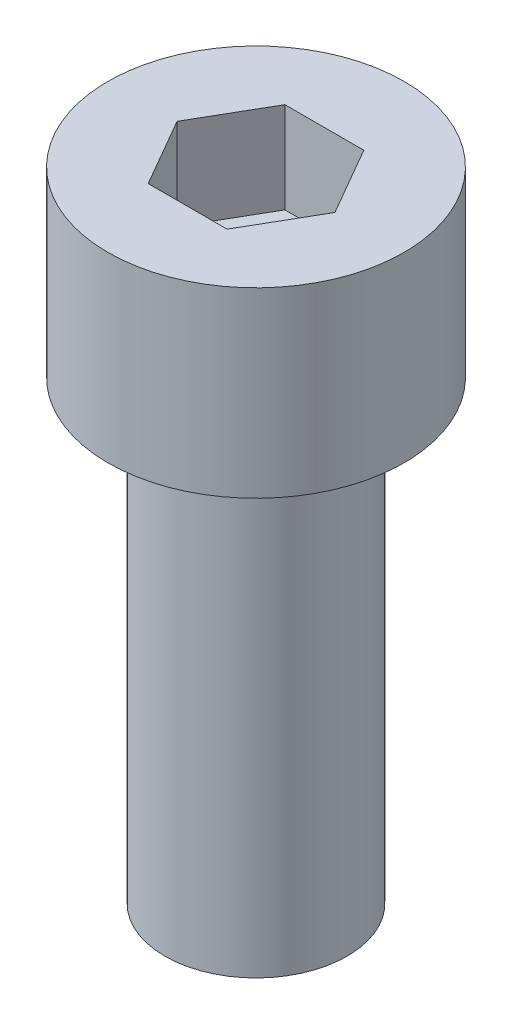
ISO-10303-21;
HEADER;
FILE_DESCRIPTION(('STEP AP214'),'2;1');
FILE_NAME('part.step','',(''),(''),'','','');
FILE_SCHEMA(('AUTOMOTIVE_DESIGN { 1 0 10303 214 1 1 1 1 }'));
ENDSEC;
DATA;
#1=APPLICATION_CONTEXT('core data for automotive mechanical design processes');
#2=APPLICATION_PROTOCOL_DEFINITION('international standard','automotive_design',2000,#1);
#3=PRODUCT_CONTEXT('',#1,'mechanical');
#4=PRODUCT('Part','Part','',(#3));
#5=PRODUCT_RELATED_PRODUCT_CATEGORY('part','',(#4));
#6=PRODUCT_DEFINITION_FORMATION('','',#4);
#7=PRODUCT_DEFINITION_CONTEXT('part definition',#1,'design');
#8=PRODUCT_DEFINITION('design','',#6,#7);
#9=PRODUCT_DEFINITION_SHAPE('','',#8);
#10=(LENGTH_UNIT() NAMED_UNIT(*) SI_UNIT(.MILLI.,.METRE.));
#11=(NAMED_UNIT(*) PLANE_ANGLE_UNIT() SI_UNIT($,.RADIAN.));
#12=(NAMED_UNIT(*) SI_UNIT($,.STERADIAN.) SOLID_ANGLE_UNIT());
#13=UNCERTAINTY_MEASURE_WITH_UNIT(LENGTH_MEASURE(1.E-05),#10,'distance_accuracy_value','');
#14=(GEOMETRIC_REPRESENTATION_CONTEXT(3) GLOBAL_UNCERTAINTY_ASSIGNED_CONTEXT((#13)) GLOBAL_UNIT_ASSIGNED_CONTEXT((#10,
#11,#12)) REPRESENTATION_CONTEXT('',''));
#15=CARTESIAN_POINT('',(0.,0.,0.));
#16=DIRECTION('',(0.,0.,1.));
#17=DIRECTION('',(1.,0.,0.));
#18=AXIS2_PLACEMENT_3D('',#15,#16,#17);
#19=CARTESIAN_POINT('',(0.,-20.,0.));
#20=DIRECTION('',(0.,1.,0.));
#21=DIRECTION('',(0.,0.,1.));
#22=AXIS2_PLACEMENT_3D('',#19,#20,#21);
#23=PLANE('',#22);
#24=CARTESIAN_POINT('',(0.,-20.,0.));
#25=DIRECTION('',(0.,1.,0.));
#26=DIRECTION('',(0.,0.,1.));
#27=AXIS2_PLACEMENT_3D('',#24,#25,#26);
#28=CIRCLE('',#27,4.00000000000001);
#29=CARTESIAN_POINT('',(0.,-20.,4.00000000000001));
#30=VERTEX_POINT('',#29);
#31=EDGE_CURVE('E11',#30,#30,#28,.T.);
#32=ORIENTED_EDGE('',*,*,#31,.F.);
#33=EDGE_LOOP('',(#32));
#34=FACE_BOUND('',#33,.T.);
#35=ADVANCED_FACE('F38',(#34),#23,.F.);
#36=CARTESIAN_POINT('',(0.,61.6916426261037,0.));
#37=DIRECTION('',(0.,1.,0.));
#38=DIRECTION('',(0.,0.,1.));
#39=AXIS2_PLACEMENT_3D('',#36,#37,#38);
#40=CYLINDRICAL_SURFACE('',#39,4.00000000000001);
#41=CARTESIAN_POINT('',(0.,0.,0.));
#42=DIRECTION('',(0.,1.,0.));
#43=DIRECTION('',(0.,0.,1.));
#44=AXIS2_PLACEMENT_3D('',#41,#42,#43);
#45=CIRCLE('',#44,4.00000000000001);
#46=CARTESIAN_POINT('',(0.,0.,4.00000000000001));
#47=VERTEX_POINT('',#46);
#48=EDGE_CURVE('E45',#47,#47,#45,.T.);
#49=ORIENTED_EDGE('',*,*,#48,.F.);
#50=EDGE_LOOP('',(#49));
#51=FACE_BOUND('',#50,.T.);
#52=ORIENTED_EDGE('',*,*,#31,.T.);
#53=EDGE_LOOP('',(#52));
#54=FACE_BOUND('',#53,.T.);
#55=ADVANCED_FACE('F154',(#51,#54),#40,.T.);
#56=CARTESIAN_POINT('',(4.00000000000001,0.,0.));
#57=DIRECTION('',(0.,1.,0.));
#58=DIRECTION('',(0.,0.,1.));
#59=AXIS2_PLACEMENT_3D('',#56,#57,#58);
#60=PLANE('',#59);
#61=CARTESIAN_POINT('',(0.,0.,0.));
#62=DIRECTION('',(0.,1.,0.));
#63=DIRECTION('',(0.,0.,1.));
#64=AXIS2_PLACEMENT_3D('',#61,#62,#63);
#65=CIRCLE('',#64,6.50000000000001);
#66=CARTESIAN_POINT('',(0.,0.,6.50000000000001));
#67=VERTEX_POINT('',#66);
#68=EDGE_CURVE('E147',#67,#67,#65,.T.);
#69=ORIENTED_EDGE('',*,*,#68,.F.);
#70=EDGE_LOOP('',(#69));
#71=FACE_BOUND('',#70,.T.);
#72=ORIENTED_EDGE('',*,*,#48,.T.);
#73=EDGE_LOOP('',(#72));
#74=FACE_BOUND('',#73,.T.);
#75=ADVANCED_FACE('F152',(#71,#74),#60,.F.);
#76=CARTESIAN_POINT('',(0.,61.6916426261037,0.));
#77=DIRECTION('',(0.,1.,0.));
#78=DIRECTION('',(0.,0.,1.));
#79=AXIS2_PLACEMENT_3D('',#76,#77,#78);
#80=CYLINDRICAL_SURFACE('',#79,6.50000000000001);
#81=CARTESIAN_POINT('',(0.,8.,0.));
#82=DIRECTION('',(0.,1.,0.));
#83=DIRECTION('',(0.,0.,1.));
#84=AXIS2_PLACEMENT_3D('',#81,#82,#83);
#85=CIRCLE('',#84,6.50000000000001);
#86=CARTESIAN_POINT('',(0.,8.,6.50000000000001));
#87=VERTEX_POINT('',#86);
#88=EDGE_CURVE('E139',#87,#87,#85,.T.);
#89=ORIENTED_EDGE('',*,*,#88,.F.);
#90=EDGE_LOOP('',(#89));
#91=FACE_BOUND('',#90,.T.);
#92=ORIENTED_EDGE('',*,*,#68,.T.);
#93=EDGE_LOOP('',(#92));
#94=FACE_BOUND('',#93,.T.);
#95=ADVANCED_FACE('F172',(#91,#94),#80,.T.);
#96=CARTESIAN_POINT('',(6.50000000000001,8.,0.));
#97=DIRECTION('',(0.,-1.,0.));
#98=DIRECTION('',(0.,0.,-1.));
#99=AXIS2_PLACEMENT_3D('',#96,#97,#98);
#100=PLANE('',#99);
#101=DIRECTION('',(-1.,0.,0.));
#102=VECTOR('',#101,1.);
#103=CARTESIAN_POINT('',(1.73205080756888,8.,-3.));
#104=LINE('',#103,#102);
#105=CARTESIAN_POINT('',(1.73205080756888,8.,-3.));
#106=VERTEX_POINT('',#105);
#107=CARTESIAN_POINT('',(-1.73205080756888,8.,-3.));
#108=VERTEX_POINT('',#107);
#109=EDGE_CURVE('E126',#106,#108,#104,.T.);
#110=ORIENTED_EDGE('',*,*,#109,.F.);
#111=DIRECTION('',(-0.5,0.,-0.866025403784439));
#112=VECTOR('',#111,1.);
#113=CARTESIAN_POINT('',(3.46410161513775,8.,0.));
#114=LINE('',#113,#112);
#115=CARTESIAN_POINT('',(3.46410161513775,8.,0.));
#116=VERTEX_POINT('',#115);
#117=EDGE_CURVE('E52',#116,#106,#114,.T.);
#118=ORIENTED_EDGE('',*,*,#117,.F.);
#119=DIRECTION('',(0.5,0.,-0.866025403784439));
#120=VECTOR('',#119,1.);
#121=CARTESIAN_POINT('',(1.73205080756888,8.,3.));
#122=LINE('',#121,#120);
#123=CARTESIAN_POINT('',(1.73205080756888,8.,3.));
#124=VERTEX_POINT('',#123);
#125=EDGE_CURVE('E135',#124,#116,#122,.T.);
#126=ORIENTED_EDGE('',*,*,#125,.F.);
#127=DIRECTION('',(1.,0.,0.));
#128=VECTOR('',#127,1.);
#129=CARTESIAN_POINT('',(-1.73205080756888,8.,3.));
#130=LINE('',#129,#128);
#131=CARTESIAN_POINT('',(-1.73205080756888,8.,3.));
#132=VERTEX_POINT('',#131);
#133=EDGE_CURVE('E133',#132,#124,#130,.T.);
#134=ORIENTED_EDGE('',*,*,#133,.F.);
#135=DIRECTION('',(0.5,0.,0.866025403784438));
#136=VECTOR('',#135,1.);
#137=CARTESIAN_POINT('',(-3.46410161513775,8.,0.));
#138=LINE('',#137,#136);
#139=CARTESIAN_POINT('',(-3.46410161513775,8.,0.));
#140=VERTEX_POINT('',#139);
#141=EDGE_CURVE('E100',#140,#132,#138,.T.);
#142=ORIENTED_EDGE('',*,*,#141,.F.);
#143=DIRECTION('',(-0.5,0.,0.866025403784439));
#144=VECTOR('',#143,1.);
#145=CARTESIAN_POINT('',(-1.73205080756888,8.,-3.));
#146=LINE('',#145,#144);
#147=EDGE_CURVE('E129',#108,#140,#146,.T.);
#148=ORIENTED_EDGE('',*,*,#147,.F.);
#149=EDGE_LOOP('',(#110,#118,#126,#134,#142,#148));
#150=FACE_BOUND('',#149,.T.);
#151=ORIENTED_EDGE('',*,*,#88,.T.);
#152=EDGE_LOOP('',(#151));
#153=FACE_BOUND('',#152,.T.);
#154=ADVANCED_FACE('F180',(#150,#153),#100,.F.);
#155=CARTESIAN_POINT('',(3.46410161513775,4.,0.));
#156=DIRECTION('',(0.866025403784439,0.,-0.5));
#157=DIRECTION('',(-0.5,0.,-0.866025403784439));
#158=AXIS2_PLACEMENT_3D('',#155,#156,#157);
#159=PLANE('',#158);
#160=ORIENTED_EDGE('',*,*,#117,.T.);
#161=DIRECTION('',(0.,1.,0.));
#162=VECTOR('',#161,1.);
#163=CARTESIAN_POINT('',(1.73205080756888,4.,-3.));
#164=LINE('',#163,#162);
#165=CARTESIAN_POINT('',(1.73205080756888,4.,-3.));
#166=VERTEX_POINT('',#165);
#167=EDGE_CURVE('E82',#166,#106,#164,.T.);
#168=ORIENTED_EDGE('',*,*,#167,.F.);
#169=DIRECTION('',(-0.5,0.,-0.866025403784439));
#170=VECTOR('',#169,1.);
#171=CARTESIAN_POINT('',(3.46410161513775,4.,0.));
#172=LINE('',#171,#170);
#173=CARTESIAN_POINT('',(3.46410161513775,4.,0.));
#174=VERTEX_POINT('',#173);
#175=EDGE_CURVE('E137',#174,#166,#172,.T.);
#176=ORIENTED_EDGE('',*,*,#175,.F.);
#177=DIRECTION('',(0.,1.,0.));
#178=VECTOR('',#177,1.);
#179=CARTESIAN_POINT('',(3.46410161513775,4.,0.));
#180=LINE('',#179,#178);
#181=EDGE_CURVE('E60',#174,#116,#180,.T.);
#182=ORIENTED_EDGE('',*,*,#181,.T.);
#183=EDGE_LOOP('',(#160,#168,#176,#182));
#184=FACE_BOUND('',#183,.T.);
#185=ADVANCED_FACE('F188',(#184),#159,.F.);
#186=CARTESIAN_POINT('',(1.73205080756888,4.,3.));
#187=DIRECTION('',(0.866025403784439,0.,0.5));
#188=DIRECTION('',(0.5,0.,-0.866025403784439));
#189=AXIS2_PLACEMENT_3D('',#186,#187,#188);
#190=PLANE('',#189);
#191=ORIENTED_EDGE('',*,*,#125,.T.);
#192=ORIENTED_EDGE('',*,*,#181,.F.);
#193=DIRECTION('',(0.5,0.,-0.866025403784439));
#194=VECTOR('',#193,1.);
#195=CARTESIAN_POINT('',(1.73205080756888,4.,3.));
#196=LINE('',#195,#194);
#197=CARTESIAN_POINT('',(1.73205080756888,4.,3.));
#198=VERTEX_POINT('',#197);
#199=EDGE_CURVE('E112',#198,#174,#196,.T.);
#200=ORIENTED_EDGE('',*,*,#199,.F.);
#201=DIRECTION('',(0.,1.,0.));
#202=VECTOR('',#201,1.);
#203=CARTESIAN_POINT('',(1.73205080756888,4.,3.));
#204=LINE('',#203,#202);
#205=EDGE_CURVE('E104',#198,#124,#204,.T.);
#206=ORIENTED_EDGE('',*,*,#205,.T.);
#207=EDGE_LOOP('',(#191,#192,#200,#206));
#208=FACE_BOUND('',#207,.T.);
#209=ADVANCED_FACE('F196',(#208),#190,.F.);
#210=CARTESIAN_POINT('',(-1.73205080756888,4.,3.));
#211=DIRECTION('',(0.,0.,1.));
#212=DIRECTION('',(1.,0.,0.));
#213=AXIS2_PLACEMENT_3D('',#210,#211,#212);
#214=PLANE('',#213);
#215=ORIENTED_EDGE('',*,*,#133,.T.);
#216=ORIENTED_EDGE('',*,*,#205,.F.);
#217=DIRECTION('',(1.,0.,0.));
#218=VECTOR('',#217,1.);
#219=CARTESIAN_POINT('',(-1.73205080756888,4.,3.));
#220=LINE('',#219,#218);
#221=CARTESIAN_POINT('',(-1.73205080756888,4.,3.));
#222=VERTEX_POINT('',#221);
#223=EDGE_CURVE('E108',#222,#198,#220,.T.);
#224=ORIENTED_EDGE('',*,*,#223,.F.);
#225=DIRECTION('',(0.,1.,0.));
#226=VECTOR('',#225,1.);
#227=CARTESIAN_POINT('',(-1.73205080756888,4.,3.));
#228=LINE('',#227,#226);
#229=EDGE_CURVE('E93',#222,#132,#228,.T.);
#230=ORIENTED_EDGE('',*,*,#229,.T.);
#231=EDGE_LOOP('',(#215,#216,#224,#230));
#232=FACE_BOUND('',#231,.T.);
#233=ADVANCED_FACE('F109',(#232),#214,.F.);
#234=CARTESIAN_POINT('',(-3.46410161513775,4.,0.));
#235=DIRECTION('',(-0.866025403784438,0.,0.5));
#236=DIRECTION('',(0.5,0.,0.866025403784438));
#237=AXIS2_PLACEMENT_3D('',#234,#235,#236);
#238=PLANE('',#237);
#239=ORIENTED_EDGE('',*,*,#141,.T.);
#240=ORIENTED_EDGE('',*,*,#229,.F.);
#241=DIRECTION('',(0.5,0.,0.866025403784438));
#242=VECTOR('',#241,1.);
#243=CARTESIAN_POINT('',(-3.46410161513775,4.,0.));
#244=LINE('',#243,#242);
#245=CARTESIAN_POINT('',(-3.46410161513775,4.,0.));
#246=VERTEX_POINT('',#245);
#247=EDGE_CURVE('E97',#246,#222,#244,.T.);
#248=ORIENTED_EDGE('',*,*,#247,.F.);
#249=DIRECTION('',(0.,1.,0.));
#250=VECTOR('',#249,1.);
#251=CARTESIAN_POINT('',(-3.46410161513775,4.,0.));
#252=LINE('',#251,#250);
#253=EDGE_CURVE('E105',#246,#140,#252,.T.);
#254=ORIENTED_EDGE('',*,*,#253,.T.);
#255=EDGE_LOOP('',(#239,#240,#248,#254));
#256=FACE_BOUND('',#255,.T.);
#257=ADVANCED_FACE('F95',(#256),#238,.F.);
#258=CARTESIAN_POINT('',(-1.73205080756888,4.,-3.));
#259=DIRECTION('',(-0.866025403784439,0.,-0.5));
#260=DIRECTION('',(-0.5,0.,0.866025403784439));
#261=AXIS2_PLACEMENT_3D('',#258,#259,#260);
#262=PLANE('',#261);
#263=ORIENTED_EDGE('',*,*,#147,.T.);
#264=ORIENTED_EDGE('',*,*,#253,.F.);
#265=DIRECTION('',(-0.5,0.,0.866025403784439));
#266=VECTOR('',#265,1.);
#267=CARTESIAN_POINT('',(-1.73205080756888,4.,-3.));
#268=LINE('',#267,#266);
#269=CARTESIAN_POINT('',(-1.73205080756888,4.,-3.));
#270=VERTEX_POINT('',#269);
#271=EDGE_CURVE('E118',#270,#246,#268,.T.);
#272=ORIENTED_EDGE('',*,*,#271,.F.);
#273=DIRECTION('',(0.,1.,0.));
#274=VECTOR('',#273,1.);
#275=CARTESIAN_POINT('',(-1.73205080756888,4.,-3.));
#276=LINE('',#275,#274);
#277=EDGE_CURVE('E142',#270,#108,#276,.T.);
#278=ORIENTED_EDGE('',*,*,#277,.T.);
#279=EDGE_LOOP('',(#263,#264,#272,#278));
#280=FACE_BOUND('',#279,.T.);
#281=ADVANCED_FACE('F215',(#280),#262,.F.);
#282=CARTESIAN_POINT('',(1.73205080756888,4.,-3.));
#283=DIRECTION('',(0.,0.,-1.));
#284=DIRECTION('',(-1.,0.,0.));
#285=AXIS2_PLACEMENT_3D('',#282,#283,#284);
#286=PLANE('',#285);
#287=ORIENTED_EDGE('',*,*,#109,.T.);
#288=ORIENTED_EDGE('',*,*,#277,.F.);
#289=DIRECTION('',(-1.,0.,0.));
#290=VECTOR('',#289,1.);
#291=CARTESIAN_POINT('',(1.73205080756888,4.,-3.));
#292=LINE('',#291,#290);
#293=EDGE_CURVE('E120',#166,#270,#292,.T.);
#294=ORIENTED_EDGE('',*,*,#293,.F.);
#295=ORIENTED_EDGE('',*,*,#167,.T.);
#296=EDGE_LOOP('',(#287,#288,#294,#295));
#297=FACE_BOUND('',#296,.T.);
#298=ADVANCED_FACE('F222',(#297),#286,.F.);
#299=CARTESIAN_POINT('',(3.46410161513775,4.,0.));
#300=DIRECTION('',(0.,-1.,0.));
#301=DIRECTION('',(0.,0.,-1.));
#302=AXIS2_PLACEMENT_3D('',#299,#300,#301);
#303=PLANE('',#302);
#304=ORIENTED_EDGE('',*,*,#175,.T.);
#305=ORIENTED_EDGE('',*,*,#293,.T.);
#306=ORIENTED_EDGE('',*,*,#271,.T.);
#307=ORIENTED_EDGE('',*,*,#247,.T.);
#308=ORIENTED_EDGE('',*,*,#223,.T.);
#309=ORIENTED_EDGE('',*,*,#199,.T.);
#310=EDGE_LOOP('',(#304,#305,#306,#307,#308,#309));
#311=FACE_BOUND('',#310,.T.);
#312=ADVANCED_FACE('F115',(#311),#303,.F.);
#313=CLOSED_SHELL('',(#35,#55,#75,#95,#154,#185,#209,#233,#257,#281,#298,#312));
#314=MANIFOLD_SOLID_BREP('B2',#313);
#315=ADVANCED_BREP_SHAPE_REPRESENTATION('',(#18,#314),#14);
#316=SHAPE_DEFINITION_REPRESENTATION(#9,#315);
ENDSEC;
END-ISO-10303-21;
